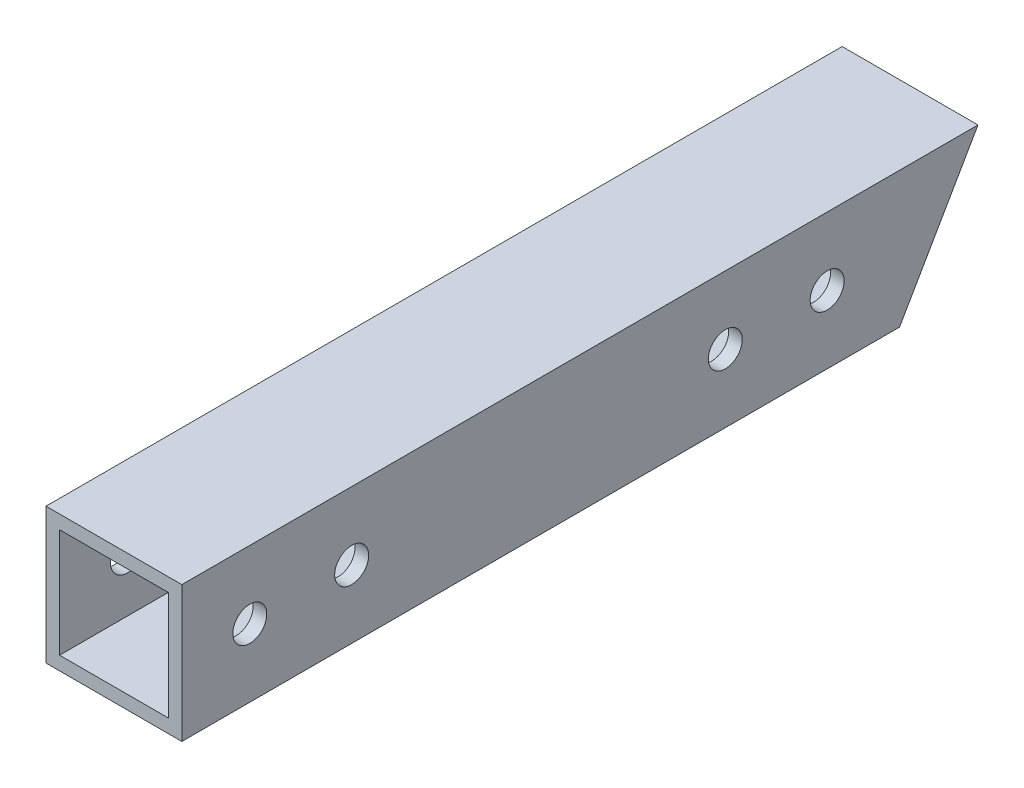
ISO-10303-21;
HEADER;
FILE_DESCRIPTION(('STEP AP214'),'2;1');
FILE_NAME('part.step','',(''),(''),'','','');
FILE_SCHEMA(('AUTOMOTIVE_DESIGN { 1 0 10303 214 1 1 1 1 }'));
ENDSEC;
DATA;
#1=APPLICATION_CONTEXT('core data for automotive mechanical design processes');
#2=APPLICATION_PROTOCOL_DEFINITION('international standard','automotive_design',2000,#1);
#3=PRODUCT_CONTEXT('',#1,'mechanical');
#4=PRODUCT('Part','Part','',(#3));
#5=PRODUCT_RELATED_PRODUCT_CATEGORY('part','',(#4));
#6=PRODUCT_DEFINITION_FORMATION('','',#4);
#7=PRODUCT_DEFINITION_CONTEXT('part definition',#1,'design');
#8=PRODUCT_DEFINITION('design','',#6,#7);
#9=PRODUCT_DEFINITION_SHAPE('','',#8);
#10=(LENGTH_UNIT() NAMED_UNIT(*) SI_UNIT(.MILLI.,.METRE.));
#11=(NAMED_UNIT(*) PLANE_ANGLE_UNIT() SI_UNIT($,.RADIAN.));
#12=(NAMED_UNIT(*) SI_UNIT($,.STERADIAN.) SOLID_ANGLE_UNIT());
#13=UNCERTAINTY_MEASURE_WITH_UNIT(LENGTH_MEASURE(1.E-05),#10,'distance_accuracy_value','');
#14=(GEOMETRIC_REPRESENTATION_CONTEXT(3) GLOBAL_UNCERTAINTY_ASSIGNED_CONTEXT((#13)) GLOBAL_UNIT_ASSIGNED_CONTEXT((#10,
#11,#12)) REPRESENTATION_CONTEXT('',''));
#15=CARTESIAN_POINT('',(0.,0.,0.));
#16=DIRECTION('',(0.,0.,1.));
#17=DIRECTION('',(1.,0.,0.));
#18=AXIS2_PLACEMENT_3D('',#15,#16,#17);
#19=CARTESIAN_POINT('',(0.,0.,100.));
#20=DIRECTION('',(0.,0.,1.));
#21=DIRECTION('',(1.,0.,0.));
#22=AXIS2_PLACEMENT_3D('',#19,#20,#21);
#23=PLANE('',#22);
#24=DIRECTION('',(0.,1.,0.));
#25=VECTOR('',#24,1.);
#26=CARTESIAN_POINT('',(10.,9.99999999999999,100.));
#27=LINE('',#26,#25);
#28=CARTESIAN_POINT('',(10.,-10.,100.));
#29=VERTEX_POINT('',#28);
#30=CARTESIAN_POINT('',(10.,9.99999999999999,100.));
#31=VERTEX_POINT('',#30);
#32=EDGE_CURVE('E127',#29,#31,#27,.T.);
#33=ORIENTED_EDGE('',*,*,#32,.T.);
#34=DIRECTION('',(-1.,0.,0.));
#35=VECTOR('',#34,1.);
#36=CARTESIAN_POINT('',(-10.,9.99999999999999,100.));
#37=LINE('',#36,#35);
#38=CARTESIAN_POINT('',(-10.,9.99999999999999,100.));
#39=VERTEX_POINT('',#38);
#40=EDGE_CURVE('E183',#31,#39,#37,.T.);
#41=ORIENTED_EDGE('',*,*,#40,.T.);
#42=DIRECTION('',(0.,-1.,0.));
#43=VECTOR('',#42,1.);
#44=CARTESIAN_POINT('',(-10.,9.99999999999999,100.));
#45=LINE('',#44,#43);
#46=CARTESIAN_POINT('',(-10.,-10.,100.));
#47=VERTEX_POINT('',#46);
#48=EDGE_CURVE('E132',#39,#47,#45,.T.);
#49=ORIENTED_EDGE('',*,*,#48,.T.);
#50=DIRECTION('',(1.,0.,0.));
#51=VECTOR('',#50,1.);
#52=CARTESIAN_POINT('',(-10.,-10.,100.));
#53=LINE('',#52,#51);
#54=EDGE_CURVE('E128',#47,#29,#53,.T.);
#55=ORIENTED_EDGE('',*,*,#54,.T.);
#56=EDGE_LOOP('',(#33,#41,#49,#55));
#57=FACE_BOUND('',#56,.T.);
#58=DIRECTION('',(-1.,0.,0.));
#59=VECTOR('',#58,1.);
#60=CARTESIAN_POINT('',(-8.00000000000002,8.00000000000001,100.));
#61=LINE('',#60,#59);
#62=CARTESIAN_POINT('',(7.99999999999999,8.00000000000001,100.));
#63=VERTEX_POINT('',#62);
#64=CARTESIAN_POINT('',(-8.00000000000002,8.00000000000001,100.));
#65=VERTEX_POINT('',#64);
#66=EDGE_CURVE('E226',#63,#65,#61,.T.);
#67=ORIENTED_EDGE('',*,*,#66,.F.);
#68=DIRECTION('',(0.,1.,0.));
#69=VECTOR('',#68,1.);
#70=CARTESIAN_POINT('',(7.99999999999999,8.00000000000001,100.));
#71=LINE('',#70,#69);
#72=CARTESIAN_POINT('',(7.99999999999999,-8.00000000000002,100.));
#73=VERTEX_POINT('',#72);
#74=EDGE_CURVE('E224',#73,#63,#71,.T.);
#75=ORIENTED_EDGE('',*,*,#74,.F.);
#76=DIRECTION('',(1.,0.,0.));
#77=VECTOR('',#76,1.);
#78=CARTESIAN_POINT('',(-8.00000000000002,-8.00000000000002,100.));
#79=LINE('',#78,#77);
#80=CARTESIAN_POINT('',(-8.00000000000002,-8.00000000000002,100.));
#81=VERTEX_POINT('',#80);
#82=EDGE_CURVE('E172',#81,#73,#79,.T.);
#83=ORIENTED_EDGE('',*,*,#82,.F.);
#84=DIRECTION('',(0.,-1.,0.));
#85=VECTOR('',#84,1.);
#86=CARTESIAN_POINT('',(-8.00000000000002,8.00000000000001,100.));
#87=LINE('',#86,#85);
#88=EDGE_CURVE('E176',#65,#81,#87,.T.);
#89=ORIENTED_EDGE('',*,*,#88,.F.);
#90=EDGE_LOOP('',(#67,#75,#83,#89));
#91=FACE_BOUND('',#90,.T.);
#92=ADVANCED_FACE('F37',(#57,#91),#23,.T.);
#93=CARTESIAN_POINT('',(10.,9.99999999999999,100.));
#94=DIRECTION('',(-1.,0.,0.));
#95=DIRECTION('',(0.,0.,1.));
#96=AXIS2_PLACEMENT_3D('',#93,#94,#95);
#97=PLANE('',#96);
#98=CARTESIAN_POINT('',(10.,0.,90.));
#99=DIRECTION('',(1.,0.,0.));
#100=DIRECTION('',(0.,0.,-1.));
#101=AXIS2_PLACEMENT_3D('',#98,#99,#100);
#102=CIRCLE('',#101,2.49999999999999);
#103=CARTESIAN_POINT('',(10.,0.,87.5));
#104=VERTEX_POINT('',#103);
#105=EDGE_CURVE('E196',#104,#104,#102,.T.);
#106=ORIENTED_EDGE('',*,*,#105,.F.);
#107=EDGE_LOOP('',(#106));
#108=FACE_BOUND('',#107,.T.);
#109=CARTESIAN_POINT('',(10.,0.,20.));
#110=DIRECTION('',(1.,0.,0.));
#111=DIRECTION('',(0.,0.,-1.));
#112=AXIS2_PLACEMENT_3D('',#109,#110,#111);
#113=CIRCLE('',#112,2.5);
#114=CARTESIAN_POINT('',(10.,0.,17.5));
#115=VERTEX_POINT('',#114);
#116=EDGE_CURVE('E193',#115,#115,#113,.T.);
#117=ORIENTED_EDGE('',*,*,#116,.F.);
#118=EDGE_LOOP('',(#117));
#119=FACE_BOUND('',#118,.T.);
#120=CARTESIAN_POINT('',(10.,0.,5.));
#121=DIRECTION('',(1.,0.,0.));
#122=DIRECTION('',(0.,0.,-1.));
#123=AXIS2_PLACEMENT_3D('',#120,#121,#122);
#124=CIRCLE('',#123,2.5);
#125=CARTESIAN_POINT('',(10.,0.,2.5));
#126=VERTEX_POINT('',#125);
#127=EDGE_CURVE('E203',#126,#126,#124,.T.);
#128=ORIENTED_EDGE('',*,*,#127,.F.);
#129=EDGE_LOOP('',(#128));
#130=FACE_BOUND('',#129,.T.);
#131=CARTESIAN_POINT('',(10.,0.,75.));
#132=DIRECTION('',(1.,0.,0.));
#133=DIRECTION('',(0.,0.,-1.));
#134=AXIS2_PLACEMENT_3D('',#131,#132,#133);
#135=CIRCLE('',#134,2.5);
#136=CARTESIAN_POINT('',(10.,0.,72.5));
#137=VERTEX_POINT('',#136);
#138=EDGE_CURVE('E208',#137,#137,#135,.T.);
#139=ORIENTED_EDGE('',*,*,#138,.F.);
#140=EDGE_LOOP('',(#139));
#141=FACE_BOUND('',#140,.T.);
#142=DIRECTION('',(0.,0.,-1.));
#143=VECTOR('',#142,1.);
#144=CARTESIAN_POINT('',(10.,-10.,100.));
#145=LINE('',#144,#143);
#146=CARTESIAN_POINT('',(10.,-10.,-5.66047190431926));
#147=VERTEX_POINT('',#146);
#148=EDGE_CURVE('E121',#29,#147,#145,.T.);
#149=ORIENTED_EDGE('',*,*,#148,.T.);
#150=DIRECTION('',(0.,-0.866025403784442,0.499999999999995));
#151=VECTOR('',#150,1.);
#152=CARTESIAN_POINT('',(10.,1.49999999999999,-12.3));
#153=LINE('',#152,#151);
#154=CARTESIAN_POINT('',(10.,9.99999999999999,-17.2074772881118));
#155=VERTEX_POINT('',#154);
#156=EDGE_CURVE('E104',#155,#147,#153,.T.);
#157=ORIENTED_EDGE('',*,*,#156,.F.);
#158=DIRECTION('',(0.,0.,-1.));
#159=VECTOR('',#158,1.);
#160=CARTESIAN_POINT('',(10.,9.99999999999999,100.));
#161=LINE('',#160,#159);
#162=EDGE_CURVE('E137',#31,#155,#161,.T.);
#163=ORIENTED_EDGE('',*,*,#162,.F.);
#164=ORIENTED_EDGE('',*,*,#32,.F.);
#165=EDGE_LOOP('',(#149,#157,#163,#164));
#166=FACE_BOUND('',#165,.T.);
#167=ADVANCED_FACE('F39',(#108,#119,#130,#141,#166),#97,.F.);
#168=CARTESIAN_POINT('',(-10.,9.99999999999999,100.));
#169=DIRECTION('',(0.,-1.,0.));
#170=DIRECTION('',(0.,0.,-1.));
#171=AXIS2_PLACEMENT_3D('',#168,#169,#170);
#172=PLANE('',#171);
#173=ORIENTED_EDGE('',*,*,#162,.T.);
#174=DIRECTION('',(-1.,0.,0.));
#175=VECTOR('',#174,1.);
#176=CARTESIAN_POINT('',(10.,9.99999999999999,-17.2074772881118));
#177=LINE('',#176,#175);
#178=CARTESIAN_POINT('',(-10.,9.99999999999999,-17.2074772881118));
#179=VERTEX_POINT('',#178);
#180=EDGE_CURVE('E111',#155,#179,#177,.T.);
#181=ORIENTED_EDGE('',*,*,#180,.T.);
#182=DIRECTION('',(0.,0.,-1.));
#183=VECTOR('',#182,1.);
#184=CARTESIAN_POINT('',(-10.,9.99999999999999,100.));
#185=LINE('',#184,#183);
#186=EDGE_CURVE('E130',#39,#179,#185,.T.);
#187=ORIENTED_EDGE('',*,*,#186,.F.);
#188=ORIENTED_EDGE('',*,*,#40,.F.);
#189=EDGE_LOOP('',(#173,#181,#187,#188));
#190=FACE_BOUND('',#189,.T.);
#191=ADVANCED_FACE('F247',(#190),#172,.F.);
#192=CARTESIAN_POINT('',(-10.,9.99999999999999,100.));
#193=DIRECTION('',(1.,0.,0.));
#194=DIRECTION('',(0.,0.,-1.));
#195=AXIS2_PLACEMENT_3D('',#192,#193,#194);
#196=PLANE('',#195);
#197=CARTESIAN_POINT('',(-10.,0.,90.));
#198=DIRECTION('',(1.,0.,0.));
#199=DIRECTION('',(0.,0.,-1.));
#200=AXIS2_PLACEMENT_3D('',#197,#198,#199);
#201=CIRCLE('',#200,2.49999999999999);
#202=CARTESIAN_POINT('',(-10.,0.,87.5));
#203=VERTEX_POINT('',#202);
#204=EDGE_CURVE('E144',#203,#203,#201,.T.);
#205=ORIENTED_EDGE('',*,*,#204,.T.);
#206=EDGE_LOOP('',(#205));
#207=FACE_BOUND('',#206,.T.);
#208=CARTESIAN_POINT('',(-10.,0.,20.));
#209=DIRECTION('',(1.,0.,0.));
#210=DIRECTION('',(0.,0.,-1.));
#211=AXIS2_PLACEMENT_3D('',#208,#209,#210);
#212=CIRCLE('',#211,2.5);
#213=CARTESIAN_POINT('',(-10.,0.,17.5));
#214=VERTEX_POINT('',#213);
#215=EDGE_CURVE('E200',#214,#214,#212,.T.);
#216=ORIENTED_EDGE('',*,*,#215,.T.);
#217=EDGE_LOOP('',(#216));
#218=FACE_BOUND('',#217,.T.);
#219=CARTESIAN_POINT('',(-10.,0.,5.));
#220=DIRECTION('',(1.,0.,0.));
#221=DIRECTION('',(0.,0.,-1.));
#222=AXIS2_PLACEMENT_3D('',#219,#220,#221);
#223=CIRCLE('',#222,2.5);
#224=CARTESIAN_POINT('',(-10.,0.,2.5));
#225=VERTEX_POINT('',#224);
#226=EDGE_CURVE('E211',#225,#225,#223,.T.);
#227=ORIENTED_EDGE('',*,*,#226,.T.);
#228=EDGE_LOOP('',(#227));
#229=FACE_BOUND('',#228,.T.);
#230=CARTESIAN_POINT('',(-10.,0.,75.));
#231=DIRECTION('',(1.,0.,0.));
#232=DIRECTION('',(0.,0.,-1.));
#233=AXIS2_PLACEMENT_3D('',#230,#231,#232);
#234=CIRCLE('',#233,2.5);
#235=CARTESIAN_POINT('',(-10.,0.,72.5));
#236=VERTEX_POINT('',#235);
#237=EDGE_CURVE('E199',#236,#236,#234,.T.);
#238=ORIENTED_EDGE('',*,*,#237,.T.);
#239=EDGE_LOOP('',(#238));
#240=FACE_BOUND('',#239,.T.);
#241=DIRECTION('',(0.,-0.866025403784442,0.499999999999995));
#242=VECTOR('',#241,1.);
#243=CARTESIAN_POINT('',(-10.,1.49999999999999,-12.3));
#244=LINE('',#243,#242);
#245=CARTESIAN_POINT('',(-10.,-10.,-5.66047190431926));
#246=VERTEX_POINT('',#245);
#247=EDGE_CURVE('E115',#179,#246,#244,.T.);
#248=ORIENTED_EDGE('',*,*,#247,.T.);
#249=DIRECTION('',(0.,0.,-1.));
#250=VECTOR('',#249,1.);
#251=CARTESIAN_POINT('',(-10.,-10.,100.));
#252=LINE('',#251,#250);
#253=EDGE_CURVE('E124',#47,#246,#252,.T.);
#254=ORIENTED_EDGE('',*,*,#253,.F.);
#255=ORIENTED_EDGE('',*,*,#48,.F.);
#256=ORIENTED_EDGE('',*,*,#186,.T.);
#257=EDGE_LOOP('',(#248,#254,#255,#256));
#258=FACE_BOUND('',#257,.T.);
#259=ADVANCED_FACE('F189',(#207,#218,#229,#240,#258),#196,.F.);
#260=CARTESIAN_POINT('',(-10.,-10.,100.));
#261=DIRECTION('',(0.,1.,0.));
#262=DIRECTION('',(0.,0.,1.));
#263=AXIS2_PLACEMENT_3D('',#260,#261,#262);
#264=PLANE('',#263);
#265=ORIENTED_EDGE('',*,*,#253,.T.);
#266=DIRECTION('',(-1.,0.,0.));
#267=VECTOR('',#266,1.);
#268=CARTESIAN_POINT('',(10.,-10.,-5.66047190431926));
#269=LINE('',#268,#267);
#270=EDGE_CURVE('E108',#147,#246,#269,.T.);
#271=ORIENTED_EDGE('',*,*,#270,.F.);
#272=ORIENTED_EDGE('',*,*,#148,.F.);
#273=ORIENTED_EDGE('',*,*,#54,.F.);
#274=EDGE_LOOP('',(#265,#271,#272,#273));
#275=FACE_BOUND('',#274,.T.);
#276=ADVANCED_FACE('F119',(#275),#264,.F.);
#277=CARTESIAN_POINT('',(7.99999999999999,8.00000000000001,100.));
#278=DIRECTION('',(-1.,0.,0.));
#279=DIRECTION('',(0.,0.,1.));
#280=AXIS2_PLACEMENT_3D('',#277,#278,#279);
#281=PLANE('',#280);
#282=DIRECTION('',(0.,-0.866025403784442,0.499999999999995));
#283=VECTOR('',#282,1.);
#284=CARTESIAN_POINT('',(7.99999999999999,1.49999999999999,-12.3));
#285=LINE('',#284,#283);
#286=CARTESIAN_POINT('',(7.99999999999999,8.00000000000001,-16.0527767497325));
#287=VERTEX_POINT('',#286);
#288=CARTESIAN_POINT('',(8.00000000000002,-8.00000000000002,-6.8151724426985));
#289=VERTEX_POINT('',#288);
#290=EDGE_CURVE('E45',#287,#289,#285,.T.);
#291=ORIENTED_EDGE('',*,*,#290,.T.);
#292=DIRECTION('',(0.,0.,-1.));
#293=VECTOR('',#292,1.);
#294=CARTESIAN_POINT('',(7.99999999999999,-8.00000000000002,100.));
#295=LINE('',#294,#293);
#296=EDGE_CURVE('E164',#73,#289,#295,.T.);
#297=ORIENTED_EDGE('',*,*,#296,.F.);
#298=ORIENTED_EDGE('',*,*,#74,.T.);
#299=DIRECTION('',(0.,0.,-1.));
#300=VECTOR('',#299,1.);
#301=CARTESIAN_POINT('',(7.99999999999999,8.00000000000001,100.));
#302=LINE('',#301,#300);
#303=EDGE_CURVE('E167',#63,#287,#302,.T.);
#304=ORIENTED_EDGE('',*,*,#303,.T.);
#305=EDGE_LOOP('',(#291,#297,#298,#304));
#306=FACE_BOUND('',#305,.T.);
#307=CARTESIAN_POINT('',(7.99999999999999,0.,90.));
#308=DIRECTION('',(-1.,0.,0.));
#309=DIRECTION('',(0.,0.,1.));
#310=AXIS2_PLACEMENT_3D('',#307,#308,#309);
#311=CIRCLE('',#310,2.49999999999999);
#312=CARTESIAN_POINT('',(7.99999999999999,0.,92.5));
#313=VERTEX_POINT('',#312);
#314=EDGE_CURVE('E156',#313,#313,#311,.T.);
#315=ORIENTED_EDGE('',*,*,#314,.F.);
#316=EDGE_LOOP('',(#315));
#317=FACE_BOUND('',#316,.T.);
#318=CARTESIAN_POINT('',(7.99999999999999,0.,20.));
#319=DIRECTION('',(-1.,0.,0.));
#320=DIRECTION('',(0.,0.,1.));
#321=AXIS2_PLACEMENT_3D('',#318,#319,#320);
#322=CIRCLE('',#321,2.5);
#323=CARTESIAN_POINT('',(7.99999999999999,0.,22.5));
#324=VERTEX_POINT('',#323);
#325=EDGE_CURVE('E152',#324,#324,#322,.T.);
#326=ORIENTED_EDGE('',*,*,#325,.F.);
#327=EDGE_LOOP('',(#326));
#328=FACE_BOUND('',#327,.T.);
#329=CARTESIAN_POINT('',(7.99999999999999,0.,5.));
#330=DIRECTION('',(-1.,0.,0.));
#331=DIRECTION('',(0.,0.,1.));
#332=AXIS2_PLACEMENT_3D('',#329,#330,#331);
#333=CIRCLE('',#332,2.5);
#334=CARTESIAN_POINT('',(7.99999999999999,0.,7.50000000000001));
#335=VERTEX_POINT('',#334);
#336=EDGE_CURVE('E148',#335,#335,#333,.T.);
#337=ORIENTED_EDGE('',*,*,#336,.F.);
#338=EDGE_LOOP('',(#337));
#339=FACE_BOUND('',#338,.T.);
#340=CARTESIAN_POINT('',(7.99999999999999,0.,75.));
#341=DIRECTION('',(-1.,0.,0.));
#342=DIRECTION('',(0.,0.,1.));
#343=AXIS2_PLACEMENT_3D('',#340,#341,#342);
#344=CIRCLE('',#343,2.5);
#345=CARTESIAN_POINT('',(7.99999999999999,0.,77.5));
#346=VERTEX_POINT('',#345);
#347=EDGE_CURVE('E143',#346,#346,#344,.T.);
#348=ORIENTED_EDGE('',*,*,#347,.F.);
#349=EDGE_LOOP('',(#348));
#350=FACE_BOUND('',#349,.T.);
#351=ADVANCED_FACE('F161',(#306,#317,#328,#339,#350),#281,.T.);
#352=CARTESIAN_POINT('',(-8.00000000000002,8.00000000000001,100.));
#353=DIRECTION('',(0.,-1.,0.));
#354=DIRECTION('',(0.,0.,-1.));
#355=AXIS2_PLACEMENT_3D('',#352,#353,#354);
#356=PLANE('',#355);
#357=DIRECTION('',(0.,0.,-1.));
#358=VECTOR('',#357,1.);
#359=CARTESIAN_POINT('',(-8.00000000000002,8.00000000000001,100.));
#360=LINE('',#359,#358);
#361=CARTESIAN_POINT('',(-7.99999999999999,8.00000000000001,-16.0527767497325));
#362=VERTEX_POINT('',#361);
#363=EDGE_CURVE('E59',#65,#362,#360,.T.);
#364=ORIENTED_EDGE('',*,*,#363,.T.);
#365=DIRECTION('',(1.,0.,0.));
#366=VECTOR('',#365,1.);
#367=CARTESIAN_POINT('',(10.,8.00000000000001,-16.0527767497325));
#368=LINE('',#367,#366);
#369=EDGE_CURVE('E139',#362,#287,#368,.T.);
#370=ORIENTED_EDGE('',*,*,#369,.T.);
#371=ORIENTED_EDGE('',*,*,#303,.F.);
#372=ORIENTED_EDGE('',*,*,#66,.T.);
#373=EDGE_LOOP('',(#364,#370,#371,#372));
#374=FACE_BOUND('',#373,.T.);
#375=ADVANCED_FACE('F233',(#374),#356,.T.);
#376=CARTESIAN_POINT('',(-8.00000000000002,8.00000000000001,100.));
#377=DIRECTION('',(1.,0.,0.));
#378=DIRECTION('',(0.,0.,-1.));
#379=AXIS2_PLACEMENT_3D('',#376,#377,#378);
#380=PLANE('',#379);
#381=DIRECTION('',(0.,0.,-1.));
#382=VECTOR('',#381,1.);
#383=CARTESIAN_POINT('',(-8.00000000000002,-8.00000000000002,100.));
#384=LINE('',#383,#382);
#385=CARTESIAN_POINT('',(-8.00000000000002,-8.00000000000002,-6.8151724426985));
#386=VERTEX_POINT('',#385);
#387=EDGE_CURVE('E173',#81,#386,#384,.T.);
#388=ORIENTED_EDGE('',*,*,#387,.T.);
#389=DIRECTION('',(0.,0.866025403784442,-0.499999999999995));
#390=VECTOR('',#389,1.);
#391=CARTESIAN_POINT('',(-7.99999999999999,1.49999999999999,-12.3));
#392=LINE('',#391,#390);
#393=EDGE_CURVE('E51',#386,#362,#392,.T.);
#394=ORIENTED_EDGE('',*,*,#393,.T.);
#395=ORIENTED_EDGE('',*,*,#363,.F.);
#396=ORIENTED_EDGE('',*,*,#88,.T.);
#397=EDGE_LOOP('',(#388,#394,#395,#396));
#398=FACE_BOUND('',#397,.T.);
#399=CARTESIAN_POINT('',(-8.00000000000002,0.,90.));
#400=DIRECTION('',(1.,0.,0.));
#401=DIRECTION('',(0.,0.,-1.));
#402=AXIS2_PLACEMENT_3D('',#399,#400,#401);
#403=CIRCLE('',#402,2.49999999999999);
#404=CARTESIAN_POINT('',(-8.00000000000002,0.,87.5));
#405=VERTEX_POINT('',#404);
#406=EDGE_CURVE('E153',#405,#405,#403,.T.);
#407=ORIENTED_EDGE('',*,*,#406,.F.);
#408=EDGE_LOOP('',(#407));
#409=FACE_BOUND('',#408,.T.);
#410=CARTESIAN_POINT('',(-8.00000000000002,0.,20.));
#411=DIRECTION('',(1.,0.,0.));
#412=DIRECTION('',(0.,0.,-1.));
#413=AXIS2_PLACEMENT_3D('',#410,#411,#412);
#414=CIRCLE('',#413,2.5);
#415=CARTESIAN_POINT('',(-8.00000000000002,0.,17.5));
#416=VERTEX_POINT('',#415);
#417=EDGE_CURVE('E149',#416,#416,#414,.T.);
#418=ORIENTED_EDGE('',*,*,#417,.F.);
#419=EDGE_LOOP('',(#418));
#420=FACE_BOUND('',#419,.T.);
#421=CARTESIAN_POINT('',(-8.00000000000002,0.,5.));
#422=DIRECTION('',(1.,0.,0.));
#423=DIRECTION('',(0.,0.,-1.));
#424=AXIS2_PLACEMENT_3D('',#421,#422,#423);
#425=CIRCLE('',#424,2.5);
#426=CARTESIAN_POINT('',(-8.00000000000002,0.,2.5));
#427=VERTEX_POINT('',#426);
#428=EDGE_CURVE('E145',#427,#427,#425,.T.);
#429=ORIENTED_EDGE('',*,*,#428,.F.);
#430=EDGE_LOOP('',(#429));
#431=FACE_BOUND('',#430,.T.);
#432=CARTESIAN_POINT('',(-8.00000000000002,0.,75.));
#433=DIRECTION('',(1.,0.,0.));
#434=DIRECTION('',(0.,0.,-1.));
#435=AXIS2_PLACEMENT_3D('',#432,#433,#434);
#436=CIRCLE('',#435,2.5);
#437=CARTESIAN_POINT('',(-8.00000000000002,0.,72.5));
#438=VERTEX_POINT('',#437);
#439=EDGE_CURVE('E140',#438,#438,#436,.T.);
#440=ORIENTED_EDGE('',*,*,#439,.F.);
#441=EDGE_LOOP('',(#440));
#442=FACE_BOUND('',#441,.T.);
#443=ADVANCED_FACE('F230',(#398,#409,#420,#431,#442),#380,.T.);
#444=CARTESIAN_POINT('',(-8.00000000000002,-8.00000000000002,100.));
#445=DIRECTION('',(0.,1.,0.));
#446=DIRECTION('',(0.,0.,1.));
#447=AXIS2_PLACEMENT_3D('',#444,#445,#446);
#448=PLANE('',#447);
#449=DIRECTION('',(1.,0.,0.));
#450=VECTOR('',#449,1.);
#451=CARTESIAN_POINT('',(-8.00000000000002,-8.00000000000002,-6.8151724426985));
#452=LINE('',#451,#450);
#453=EDGE_CURVE('E11',#386,#289,#452,.T.);
#454=ORIENTED_EDGE('',*,*,#453,.F.);
#455=ORIENTED_EDGE('',*,*,#387,.F.);
#456=ORIENTED_EDGE('',*,*,#82,.T.);
#457=ORIENTED_EDGE('',*,*,#296,.T.);
#458=EDGE_LOOP('',(#454,#455,#456,#457));
#459=FACE_BOUND('',#458,.T.);
#460=ADVANCED_FACE('F170',(#459),#448,.T.);
#461=CARTESIAN_POINT('',(-10.,0.,75.));
#462=DIRECTION('',(1.,0.,0.));
#463=DIRECTION('',(0.,0.,-1.));
#464=AXIS2_PLACEMENT_3D('',#461,#462,#463);
#465=CYLINDRICAL_SURFACE('',#464,2.5);
#466=ORIENTED_EDGE('',*,*,#439,.T.);
#467=EDGE_LOOP('',(#466));
#468=FACE_BOUND('',#467,.T.);
#469=ORIENTED_EDGE('',*,*,#237,.F.);
#470=EDGE_LOOP('',(#469));
#471=FACE_BOUND('',#470,.T.);
#472=ADVANCED_FACE('F293',(#468,#471),#465,.F.);
#473=CARTESIAN_POINT('',(-10.,0.,5.));
#474=DIRECTION('',(1.,0.,0.));
#475=DIRECTION('',(0.,0.,-1.));
#476=AXIS2_PLACEMENT_3D('',#473,#474,#475);
#477=CYLINDRICAL_SURFACE('',#476,2.5);
#478=ORIENTED_EDGE('',*,*,#428,.T.);
#479=EDGE_LOOP('',(#478));
#480=FACE_BOUND('',#479,.T.);
#481=ORIENTED_EDGE('',*,*,#226,.F.);
#482=EDGE_LOOP('',(#481));
#483=FACE_BOUND('',#482,.T.);
#484=ADVANCED_FACE('F332',(#480,#483),#477,.F.);
#485=CARTESIAN_POINT('',(-10.,0.,20.));
#486=DIRECTION('',(1.,0.,0.));
#487=DIRECTION('',(0.,0.,-1.));
#488=AXIS2_PLACEMENT_3D('',#485,#486,#487);
#489=CYLINDRICAL_SURFACE('',#488,2.5);
#490=ORIENTED_EDGE('',*,*,#417,.T.);
#491=EDGE_LOOP('',(#490));
#492=FACE_BOUND('',#491,.T.);
#493=ORIENTED_EDGE('',*,*,#215,.F.);
#494=EDGE_LOOP('',(#493));
#495=FACE_BOUND('',#494,.T.);
#496=ADVANCED_FACE('F323',(#492,#495),#489,.F.);
#497=CARTESIAN_POINT('',(-10.,0.,90.));
#498=DIRECTION('',(1.,0.,0.));
#499=DIRECTION('',(0.,0.,-1.));
#500=AXIS2_PLACEMENT_3D('',#497,#498,#499);
#501=CYLINDRICAL_SURFACE('',#500,2.49999999999999);
#502=ORIENTED_EDGE('',*,*,#406,.T.);
#503=EDGE_LOOP('',(#502));
#504=FACE_BOUND('',#503,.T.);
#505=ORIENTED_EDGE('',*,*,#204,.F.);
#506=EDGE_LOOP('',(#505));
#507=FACE_BOUND('',#506,.T.);
#508=ADVANCED_FACE('F314',(#504,#507),#501,.F.);
#509=ORIENTED_EDGE('',*,*,#347,.T.);
#510=EDGE_LOOP('',(#509));
#511=FACE_BOUND('',#510,.T.);
#512=ORIENTED_EDGE('',*,*,#138,.T.);
#513=EDGE_LOOP('',(#512));
#514=FACE_BOUND('',#513,.T.);
#515=ADVANCED_FACE('F329',(#511,#514),#465,.F.);
#516=ORIENTED_EDGE('',*,*,#336,.T.);
#517=EDGE_LOOP('',(#516));
#518=FACE_BOUND('',#517,.T.);
#519=ORIENTED_EDGE('',*,*,#127,.T.);
#520=EDGE_LOOP('',(#519));
#521=FACE_BOUND('',#520,.T.);
#522=ADVANCED_FACE('F320',(#518,#521),#477,.F.);
#523=ORIENTED_EDGE('',*,*,#325,.T.);
#524=EDGE_LOOP('',(#523));
#525=FACE_BOUND('',#524,.T.);
#526=ORIENTED_EDGE('',*,*,#116,.T.);
#527=EDGE_LOOP('',(#526));
#528=FACE_BOUND('',#527,.T.);
#529=ADVANCED_FACE('F311',(#525,#528),#489,.F.);
#530=ORIENTED_EDGE('',*,*,#314,.T.);
#531=EDGE_LOOP('',(#530));
#532=FACE_BOUND('',#531,.T.);
#533=ORIENTED_EDGE('',*,*,#105,.T.);
#534=EDGE_LOOP('',(#533));
#535=FACE_BOUND('',#534,.T.);
#536=ADVANCED_FACE('F303',(#532,#535),#501,.F.);
#537=CARTESIAN_POINT('',(10.,1.49999999999999,-12.3));
#538=DIRECTION('',(0.,-0.499999999999995,-0.866025403784442));
#539=DIRECTION('',(0.,0.866025403784442,-0.499999999999995));
#540=AXIS2_PLACEMENT_3D('',#537,#538,#539);
#541=PLANE('',#540);
#542=ORIENTED_EDGE('',*,*,#453,.T.);
#543=ORIENTED_EDGE('',*,*,#290,.F.);
#544=ORIENTED_EDGE('',*,*,#369,.F.);
#545=ORIENTED_EDGE('',*,*,#393,.F.);
#546=EDGE_LOOP('',(#542,#543,#544,#545));
#547=FACE_BOUND('',#546,.T.);
#548=ORIENTED_EDGE('',*,*,#156,.T.);
#549=ORIENTED_EDGE('',*,*,#270,.T.);
#550=ORIENTED_EDGE('',*,*,#247,.F.);
#551=ORIENTED_EDGE('',*,*,#180,.F.);
#552=EDGE_LOOP('',(#548,#549,#550,#551));
#553=FACE_BOUND('',#552,.T.);
#554=ADVANCED_FACE('F106',(#547,#553),#541,.T.);
#555=CLOSED_SHELL('',(#92,#167,#191,#259,#276,#351,#375,#443,#460,#472,#484,#496,#508,#515,#522,
#529,#536,#554));
#556=MANIFOLD_SOLID_BREP('B2',#555);
#557=ADVANCED_BREP_SHAPE_REPRESENTATION('',(#18,#556),#14);
#558=SHAPE_DEFINITION_REPRESENTATION(#9,#557);
ENDSEC;
END-ISO-10303-21;
